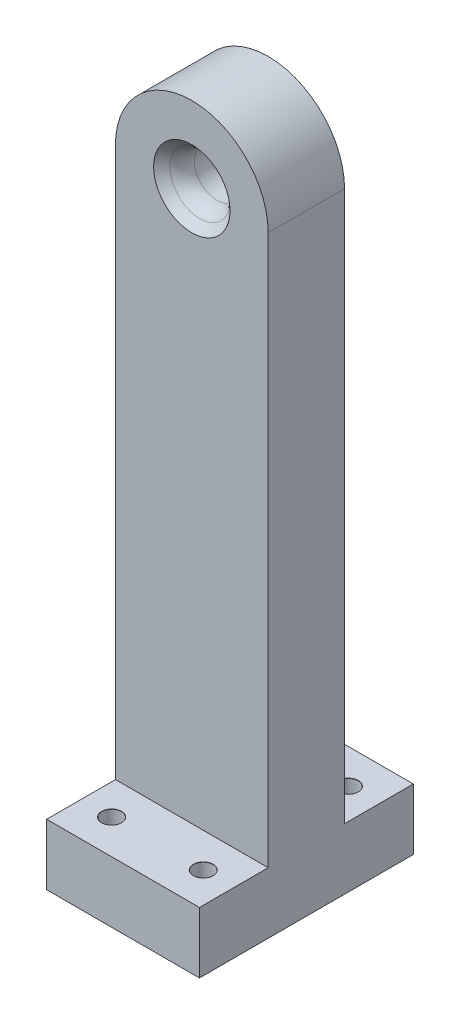
ISO-10303-21;
HEADER;
FILE_DESCRIPTION(('STEP AP214'),'2;1');
FILE_NAME('part.step','',(''),(''),'','','');
FILE_SCHEMA(('AUTOMOTIVE_DESIGN { 1 0 10303 214 1 1 1 1 }'));
ENDSEC;
DATA;
#1=APPLICATION_CONTEXT('core data for automotive mechanical design processes');
#2=APPLICATION_PROTOCOL_DEFINITION('international standard','automotive_design',2000,#1);
#3=PRODUCT_CONTEXT('',#1,'mechanical');
#4=PRODUCT('Part','Part','',(#3));
#5=PRODUCT_RELATED_PRODUCT_CATEGORY('part','',(#4));
#6=PRODUCT_DEFINITION_FORMATION('','',#4);
#7=PRODUCT_DEFINITION_CONTEXT('part definition',#1,'design');
#8=PRODUCT_DEFINITION('design','',#6,#7);
#9=PRODUCT_DEFINITION_SHAPE('','',#8);
#10=(LENGTH_UNIT() NAMED_UNIT(*) SI_UNIT(.MILLI.,.METRE.));
#11=(NAMED_UNIT(*) PLANE_ANGLE_UNIT() SI_UNIT($,.RADIAN.));
#12=(NAMED_UNIT(*) SI_UNIT($,.STERADIAN.) SOLID_ANGLE_UNIT());
#13=UNCERTAINTY_MEASURE_WITH_UNIT(LENGTH_MEASURE(1.E-05),#10,'distance_accuracy_value','');
#14=(GEOMETRIC_REPRESENTATION_CONTEXT(3) GLOBAL_UNCERTAINTY_ASSIGNED_CONTEXT((#13)) GLOBAL_UNIT_ASSIGNED_CONTEXT((#10,
#11,#12)) REPRESENTATION_CONTEXT('',''));
#15=CARTESIAN_POINT('',(0.,0.,0.));
#16=DIRECTION('',(0.,0.,1.));
#17=DIRECTION('',(1.,0.,0.));
#18=AXIS2_PLACEMENT_3D('',#15,#16,#17);
#19=CARTESIAN_POINT('',(0.,100.,35.));
#20=DIRECTION('',(0.,0.,-1.));
#21=DIRECTION('',(-1.,0.,0.));
#22=AXIS2_PLACEMENT_3D('',#19,#20,#21);
#23=PLANE('',#22);
#24=DIRECTION('',(0.,1.,0.));
#25=VECTOR('',#24,1.);
#26=CARTESIAN_POINT('',(12.5,100.,35.));
#27=LINE('',#26,#25);
#28=CARTESIAN_POINT('',(12.5,0.,35.));
#29=VERTEX_POINT('',#28);
#30=CARTESIAN_POINT('',(12.5,10.,35.));
#31=VERTEX_POINT('',#30);
#32=EDGE_CURVE('E122',#29,#31,#27,.T.);
#33=ORIENTED_EDGE('',*,*,#32,.T.);
#34=DIRECTION('',(1.,0.,0.));
#35=VECTOR('',#34,1.);
#36=CARTESIAN_POINT('',(-12.5,9.99999999999999,35.));
#37=LINE('',#36,#35);
#38=CARTESIAN_POINT('',(-12.5,9.99999999999999,35.));
#39=VERTEX_POINT('',#38);
#40=EDGE_CURVE('E110',#39,#31,#37,.T.);
#41=ORIENTED_EDGE('',*,*,#40,.F.);
#42=DIRECTION('',(0.,-1.,0.));
#43=VECTOR('',#42,1.);
#44=CARTESIAN_POINT('',(-12.5,0.,35.));
#45=LINE('',#44,#43);
#46=CARTESIAN_POINT('',(-12.5,0.,35.));
#47=VERTEX_POINT('',#46);
#48=EDGE_CURVE('E120',#39,#47,#45,.T.);
#49=ORIENTED_EDGE('',*,*,#48,.T.);
#50=DIRECTION('',(1.,0.,0.));
#51=VECTOR('',#50,1.);
#52=CARTESIAN_POINT('',(12.5,0.,35.));
#53=LINE('',#52,#51);
#54=EDGE_CURVE('E131',#47,#29,#53,.T.);
#55=ORIENTED_EDGE('',*,*,#54,.T.);
#56=EDGE_LOOP('',(#33,#41,#49,#55));
#57=FACE_BOUND('',#56,.T.);
#58=ADVANCED_FACE('F41',(#57),#23,.F.);
#59=CARTESIAN_POINT('',(0.,100.,0.));
#60=DIRECTION('',(0.,0.,-1.));
#61=DIRECTION('',(-1.,0.,0.));
#62=AXIS2_PLACEMENT_3D('',#59,#60,#61);
#63=PLANE('',#62);
#64=DIRECTION('',(1.,0.,0.));
#65=VECTOR('',#64,1.);
#66=CARTESIAN_POINT('',(-12.5,9.99999999999999,0.));
#67=LINE('',#66,#65);
#68=CARTESIAN_POINT('',(-12.5,9.99999999999999,0.));
#69=VERTEX_POINT('',#68);
#70=CARTESIAN_POINT('',(12.5,10.,0.));
#71=VERTEX_POINT('',#70);
#72=EDGE_CURVE('E220',#69,#71,#67,.T.);
#73=ORIENTED_EDGE('',*,*,#72,.T.);
#74=DIRECTION('',(0.,1.,0.));
#75=VECTOR('',#74,1.);
#76=CARTESIAN_POINT('',(12.5,100.,0.));
#77=LINE('',#76,#75);
#78=CARTESIAN_POINT('',(12.5,0.,0.));
#79=VERTEX_POINT('',#78);
#80=EDGE_CURVE('E135',#79,#71,#77,.T.);
#81=ORIENTED_EDGE('',*,*,#80,.F.);
#82=DIRECTION('',(1.,0.,0.));
#83=VECTOR('',#82,1.);
#84=CARTESIAN_POINT('',(0.,0.,0.));
#85=LINE('',#84,#83);
#86=CARTESIAN_POINT('',(-12.5,0.,0.));
#87=VERTEX_POINT('',#86);
#88=EDGE_CURVE('E141',#87,#79,#85,.T.);
#89=ORIENTED_EDGE('',*,*,#88,.F.);
#90=DIRECTION('',(0.,-1.,0.));
#91=VECTOR('',#90,1.);
#92=CARTESIAN_POINT('',(-12.5,0.,0.));
#93=LINE('',#92,#91);
#94=EDGE_CURVE('E138',#69,#87,#93,.T.);
#95=ORIENTED_EDGE('',*,*,#94,.F.);
#96=EDGE_LOOP('',(#73,#81,#89,#95));
#97=FACE_BOUND('',#96,.T.);
#98=ADVANCED_FACE('F173',(#97),#63,.T.);
#99=CARTESIAN_POINT('',(12.5,100.,35.));
#100=DIRECTION('',(-1.,0.,0.));
#101=DIRECTION('',(0.,-1.,0.));
#102=AXIS2_PLACEMENT_3D('',#99,#100,#101);
#103=PLANE('',#102);
#104=DIRECTION('',(0.,0.,-1.));
#105=VECTOR('',#104,1.);
#106=CARTESIAN_POINT('',(12.5,100.,35.));
#107=LINE('',#106,#105);
#108=CARTESIAN_POINT('',(12.5,100.,23.75));
#109=VERTEX_POINT('',#108);
#110=CARTESIAN_POINT('',(12.5,100.,11.25));
#111=VERTEX_POINT('',#110);
#112=EDGE_CURVE('E145',#109,#111,#107,.T.);
#113=ORIENTED_EDGE('',*,*,#112,.F.);
#114=DIRECTION('',(0.,1.,0.));
#115=VECTOR('',#114,1.);
#116=CARTESIAN_POINT('',(12.5,10.,23.75));
#117=LINE('',#116,#115);
#118=CARTESIAN_POINT('',(12.5,10.,23.75));
#119=VERTEX_POINT('',#118);
#120=EDGE_CURVE('E115',#119,#109,#117,.T.);
#121=ORIENTED_EDGE('',*,*,#120,.F.);
#122=DIRECTION('',(0.,0.,-1.));
#123=VECTOR('',#122,1.);
#124=CARTESIAN_POINT('',(12.5,10.,35.));
#125=LINE('',#124,#123);
#126=EDGE_CURVE('E212',#31,#119,#125,.T.);
#127=ORIENTED_EDGE('',*,*,#126,.F.);
#128=ORIENTED_EDGE('',*,*,#32,.F.);
#129=DIRECTION('',(0.,0.,-1.));
#130=VECTOR('',#129,1.);
#131=CARTESIAN_POINT('',(12.5,0.,35.));
#132=LINE('',#131,#130);
#133=EDGE_CURVE('E148',#29,#79,#132,.T.);
#134=ORIENTED_EDGE('',*,*,#133,.T.);
#135=ORIENTED_EDGE('',*,*,#80,.T.);
#136=DIRECTION('',(0.,0.,-1.));
#137=VECTOR('',#136,1.);
#138=CARTESIAN_POINT('',(12.5,10.,0.));
#139=LINE('',#138,#137);
#140=CARTESIAN_POINT('',(12.5,10.,11.25));
#141=VERTEX_POINT('',#140);
#142=EDGE_CURVE('E224',#141,#71,#139,.T.);
#143=ORIENTED_EDGE('',*,*,#142,.F.);
#144=DIRECTION('',(0.,-1.,0.));
#145=VECTOR('',#144,1.);
#146=CARTESIAN_POINT('',(12.5,10.,11.25));
#147=LINE('',#146,#145);
#148=EDGE_CURVE('E207',#111,#141,#147,.T.);
#149=ORIENTED_EDGE('',*,*,#148,.F.);
#150=EDGE_LOOP('',(#113,#121,#127,#128,#134,#135,#143,#149));
#151=FACE_BOUND('',#150,.T.);
#152=ADVANCED_FACE('F178',(#151),#103,.F.);
#153=CARTESIAN_POINT('',(0.,100.,35.));
#154=DIRECTION('',(0.,0.,-1.));
#155=DIRECTION('',(-1.,0.,0.));
#156=AXIS2_PLACEMENT_3D('',#153,#154,#155);
#157=CYLINDRICAL_SURFACE('',#156,12.5);
#158=DIRECTION('',(0.,0.,-1.));
#159=VECTOR('',#158,1.);
#160=CARTESIAN_POINT('',(-12.5,100.,35.));
#161=LINE('',#160,#159);
#162=CARTESIAN_POINT('',(-12.5,100.,23.75));
#163=VERTEX_POINT('',#162);
#164=CARTESIAN_POINT('',(-12.5,100.,11.25));
#165=VERTEX_POINT('',#164);
#166=EDGE_CURVE('E129',#163,#165,#161,.T.);
#167=ORIENTED_EDGE('',*,*,#166,.F.);
#168=CARTESIAN_POINT('',(0.,100.,23.75));
#169=DIRECTION('',(0.,0.,-1.));
#170=DIRECTION('',(-1.,0.,0.));
#171=AXIS2_PLACEMENT_3D('',#168,#169,#170);
#172=CIRCLE('',#171,12.5);
#173=EDGE_CURVE('E139',#163,#109,#172,.T.);
#174=ORIENTED_EDGE('',*,*,#173,.T.);
#175=ORIENTED_EDGE('',*,*,#112,.T.);
#176=CARTESIAN_POINT('',(0.,100.,11.25));
#177=DIRECTION('',(0.,0.,1.));
#178=DIRECTION('',(1.,0.,0.));
#179=AXIS2_PLACEMENT_3D('',#176,#177,#178);
#180=CIRCLE('',#179,12.5);
#181=EDGE_CURVE('E155',#111,#165,#180,.T.);
#182=ORIENTED_EDGE('',*,*,#181,.T.);
#183=EDGE_LOOP('',(#167,#174,#175,#182));
#184=FACE_BOUND('',#183,.T.);
#185=ADVANCED_FACE('F191',(#184),#157,.T.);
#186=CARTESIAN_POINT('',(-12.5,0.,35.));
#187=DIRECTION('',(1.,0.,0.));
#188=DIRECTION('',(0.,0.,-1.));
#189=AXIS2_PLACEMENT_3D('',#186,#187,#188);
#190=PLANE('',#189);
#191=DIRECTION('',(0.,0.,-1.));
#192=VECTOR('',#191,1.);
#193=CARTESIAN_POINT('',(-12.5,9.99999999999999,35.));
#194=LINE('',#193,#192);
#195=CARTESIAN_POINT('',(-12.5,9.99999999999999,23.75));
#196=VERTEX_POINT('',#195);
#197=EDGE_CURVE('E106',#39,#196,#194,.T.);
#198=ORIENTED_EDGE('',*,*,#197,.T.);
#199=DIRECTION('',(0.,1.,0.));
#200=VECTOR('',#199,1.);
#201=CARTESIAN_POINT('',(-12.5,9.99999999999999,23.75));
#202=LINE('',#201,#200);
#203=EDGE_CURVE('E56',#196,#163,#202,.T.);
#204=ORIENTED_EDGE('',*,*,#203,.T.);
#205=ORIENTED_EDGE('',*,*,#166,.T.);
#206=DIRECTION('',(0.,-1.,0.));
#207=VECTOR('',#206,1.);
#208=CARTESIAN_POINT('',(-12.5,9.99999999999999,11.25));
#209=LINE('',#208,#207);
#210=CARTESIAN_POINT('',(-12.5,9.99999999999999,11.25));
#211=VERTEX_POINT('',#210);
#212=EDGE_CURVE('E226',#165,#211,#209,.T.);
#213=ORIENTED_EDGE('',*,*,#212,.T.);
#214=DIRECTION('',(0.,0.,-1.));
#215=VECTOR('',#214,1.);
#216=CARTESIAN_POINT('',(-12.5,9.99999999999999,0.));
#217=LINE('',#216,#215);
#218=EDGE_CURVE('E64',#211,#69,#217,.T.);
#219=ORIENTED_EDGE('',*,*,#218,.T.);
#220=ORIENTED_EDGE('',*,*,#94,.T.);
#221=DIRECTION('',(0.,0.,-1.));
#222=VECTOR('',#221,1.);
#223=CARTESIAN_POINT('',(-12.5,0.,35.));
#224=LINE('',#223,#222);
#225=EDGE_CURVE('E127',#47,#87,#224,.T.);
#226=ORIENTED_EDGE('',*,*,#225,.F.);
#227=ORIENTED_EDGE('',*,*,#48,.F.);
#228=EDGE_LOOP('',(#198,#204,#205,#213,#219,#220,#226,#227));
#229=FACE_BOUND('',#228,.T.);
#230=ADVANCED_FACE('F125',(#229),#190,.F.);
#231=CARTESIAN_POINT('',(0.,0.,35.));
#232=DIRECTION('',(0.,1.,0.));
#233=DIRECTION('',(-1.,0.,0.));
#234=AXIS2_PLACEMENT_3D('',#231,#232,#233);
#235=PLANE('',#234);
#236=CARTESIAN_POINT('',(-7.5,0.,5.625));
#237=DIRECTION('',(0.,1.,0.));
#238=DIRECTION('',(0.,0.,1.));
#239=AXIS2_PLACEMENT_3D('',#236,#237,#238);
#240=CIRCLE('',#239,1.6);
#241=CARTESIAN_POINT('',(-7.5,0.,7.225));
#242=VERTEX_POINT('',#241);
#243=EDGE_CURVE('E292',#242,#242,#240,.T.);
#244=ORIENTED_EDGE('',*,*,#243,.T.);
#245=EDGE_LOOP('',(#244));
#246=FACE_BOUND('',#245,.T.);
#247=CARTESIAN_POINT('',(7.5,0.,5.625));
#248=DIRECTION('',(0.,1.,0.));
#249=DIRECTION('',(0.,0.,1.));
#250=AXIS2_PLACEMENT_3D('',#247,#248,#249);
#251=CIRCLE('',#250,1.6);
#252=CARTESIAN_POINT('',(7.5,0.,7.225));
#253=VERTEX_POINT('',#252);
#254=EDGE_CURVE('E303',#253,#253,#251,.T.);
#255=ORIENTED_EDGE('',*,*,#254,.T.);
#256=EDGE_LOOP('',(#255));
#257=FACE_BOUND('',#256,.T.);
#258=CARTESIAN_POINT('',(7.5,0.,29.375));
#259=DIRECTION('',(0.,1.,0.));
#260=DIRECTION('',(0.,0.,1.));
#261=AXIS2_PLACEMENT_3D('',#258,#259,#260);
#262=CIRCLE('',#261,1.6);
#263=CARTESIAN_POINT('',(7.5,0.,30.975));
#264=VERTEX_POINT('',#263);
#265=EDGE_CURVE('E312',#264,#264,#262,.T.);
#266=ORIENTED_EDGE('',*,*,#265,.T.);
#267=EDGE_LOOP('',(#266));
#268=FACE_BOUND('',#267,.T.);
#269=CARTESIAN_POINT('',(-7.5,0.,29.375));
#270=DIRECTION('',(0.,1.,0.));
#271=DIRECTION('',(0.,0.,1.));
#272=AXIS2_PLACEMENT_3D('',#269,#270,#271);
#273=CIRCLE('',#272,1.6);
#274=CARTESIAN_POINT('',(-7.5,0.,30.975));
#275=VERTEX_POINT('',#274);
#276=EDGE_CURVE('E223',#275,#275,#273,.T.);
#277=ORIENTED_EDGE('',*,*,#276,.T.);
#278=EDGE_LOOP('',(#277));
#279=FACE_BOUND('',#278,.T.);
#280=ORIENTED_EDGE('',*,*,#88,.T.);
#281=ORIENTED_EDGE('',*,*,#133,.F.);
#282=ORIENTED_EDGE('',*,*,#54,.F.);
#283=ORIENTED_EDGE('',*,*,#225,.T.);
#284=EDGE_LOOP('',(#280,#281,#282,#283));
#285=FACE_BOUND('',#284,.T.);
#286=ADVANCED_FACE('F184',(#246,#257,#268,#279,#285),#235,.F.);
#287=CARTESIAN_POINT('',(-12.5,9.99999999999999,11.25));
#288=DIRECTION('',(0.,0.,1.));
#289=DIRECTION('',(1.,0.,0.));
#290=AXIS2_PLACEMENT_3D('',#287,#288,#289);
#291=PLANE('',#290);
#292=CARTESIAN_POINT('',(0.,100.,11.25));
#293=DIRECTION('',(0.,0.,1.));
#294=DIRECTION('',(1.,0.,0.));
#295=AXIS2_PLACEMENT_3D('',#292,#293,#294);
#296=CIRCLE('',#295,3.75);
#297=CARTESIAN_POINT('',(3.75,100.,11.25));
#298=VERTEX_POINT('',#297);
#299=EDGE_CURVE('E152',#298,#298,#296,.T.);
#300=ORIENTED_EDGE('',*,*,#299,.T.);
#301=EDGE_LOOP('',(#300));
#302=FACE_BOUND('',#301,.T.);
#303=ORIENTED_EDGE('',*,*,#148,.T.);
#304=DIRECTION('',(1.,0.,0.));
#305=VECTOR('',#304,1.);
#306=CARTESIAN_POINT('',(-12.5,9.99999999999999,11.25));
#307=LINE('',#306,#305);
#308=EDGE_CURVE('E218',#211,#141,#307,.T.);
#309=ORIENTED_EDGE('',*,*,#308,.F.);
#310=ORIENTED_EDGE('',*,*,#212,.F.);
#311=ORIENTED_EDGE('',*,*,#181,.F.);
#312=EDGE_LOOP('',(#303,#309,#310,#311));
#313=FACE_BOUND('',#312,.T.);
#314=ADVANCED_FACE('F187',(#302,#313),#291,.F.);
#315=CARTESIAN_POINT('',(-12.5,9.99999999999999,0.));
#316=DIRECTION('',(0.,-1.,0.));
#317=DIRECTION('',(1.,0.,0.));
#318=AXIS2_PLACEMENT_3D('',#315,#316,#317);
#319=PLANE('',#318);
#320=CARTESIAN_POINT('',(-7.5,10.,5.625));
#321=DIRECTION('',(0.,1.,0.));
#322=DIRECTION('',(0.,0.,1.));
#323=AXIS2_PLACEMENT_3D('',#320,#321,#322);
#324=CIRCLE('',#323,1.625);
#325=CARTESIAN_POINT('',(-7.5,10.,7.25));
#326=VERTEX_POINT('',#325);
#327=EDGE_CURVE('E290',#326,#326,#324,.T.);
#328=ORIENTED_EDGE('',*,*,#327,.F.);
#329=EDGE_LOOP('',(#328));
#330=FACE_BOUND('',#329,.T.);
#331=CARTESIAN_POINT('',(7.5,10.,5.625));
#332=DIRECTION('',(0.,1.,0.));
#333=DIRECTION('',(0.,0.,1.));
#334=AXIS2_PLACEMENT_3D('',#331,#332,#333);
#335=CIRCLE('',#334,1.625);
#336=CARTESIAN_POINT('',(7.5,10.,7.25));
#337=VERTEX_POINT('',#336);
#338=EDGE_CURVE('E297',#337,#337,#335,.T.);
#339=ORIENTED_EDGE('',*,*,#338,.F.);
#340=EDGE_LOOP('',(#339));
#341=FACE_BOUND('',#340,.T.);
#342=ORIENTED_EDGE('',*,*,#142,.T.);
#343=ORIENTED_EDGE('',*,*,#72,.F.);
#344=ORIENTED_EDGE('',*,*,#218,.F.);
#345=ORIENTED_EDGE('',*,*,#308,.T.);
#346=EDGE_LOOP('',(#342,#343,#344,#345));
#347=FACE_BOUND('',#346,.T.);
#348=ADVANCED_FACE('F236',(#330,#341,#347),#319,.F.);
#349=CARTESIAN_POINT('',(-12.5,9.99999999999999,23.75));
#350=DIRECTION('',(0.,0.,-1.));
#351=DIRECTION('',(-1.,0.,0.));
#352=AXIS2_PLACEMENT_3D('',#349,#350,#351);
#353=PLANE('',#352);
#354=CARTESIAN_POINT('',(0.,100.,23.75));
#355=DIRECTION('',(0.,0.,-1.));
#356=DIRECTION('',(-1.,0.,0.));
#357=AXIS2_PLACEMENT_3D('',#354,#355,#356);
#358=CIRCLE('',#357,6.25000000000001);
#359=CARTESIAN_POINT('',(-6.25000000000001,100.,23.75));
#360=VERTEX_POINT('',#359);
#361=EDGE_CURVE('E151',#360,#360,#358,.T.);
#362=ORIENTED_EDGE('',*,*,#361,.T.);
#363=EDGE_LOOP('',(#362));
#364=FACE_BOUND('',#363,.T.);
#365=ORIENTED_EDGE('',*,*,#203,.F.);
#366=DIRECTION('',(1.,0.,0.));
#367=VECTOR('',#366,1.);
#368=CARTESIAN_POINT('',(-12.5,9.99999999999999,23.75));
#369=LINE('',#368,#367);
#370=EDGE_CURVE('E112',#196,#119,#369,.T.);
#371=ORIENTED_EDGE('',*,*,#370,.T.);
#372=ORIENTED_EDGE('',*,*,#120,.T.);
#373=ORIENTED_EDGE('',*,*,#173,.F.);
#374=EDGE_LOOP('',(#365,#371,#372,#373));
#375=FACE_BOUND('',#374,.T.);
#376=ADVANCED_FACE('F211',(#364,#375),#353,.F.);
#377=CARTESIAN_POINT('',(-12.5,9.99999999999999,35.));
#378=DIRECTION('',(0.,-1.,0.));
#379=DIRECTION('',(1.,0.,0.));
#380=AXIS2_PLACEMENT_3D('',#377,#378,#379);
#381=PLANE('',#380);
#382=CARTESIAN_POINT('',(7.5,10.,29.375));
#383=DIRECTION('',(0.,1.,0.));
#384=DIRECTION('',(0.,0.,1.));
#385=AXIS2_PLACEMENT_3D('',#382,#383,#384);
#386=CIRCLE('',#385,1.625);
#387=CARTESIAN_POINT('',(7.5,10.,31.));
#388=VERTEX_POINT('',#387);
#389=EDGE_CURVE('E306',#388,#388,#386,.T.);
#390=ORIENTED_EDGE('',*,*,#389,.F.);
#391=EDGE_LOOP('',(#390));
#392=FACE_BOUND('',#391,.T.);
#393=CARTESIAN_POINT('',(-7.5,10.,29.375));
#394=DIRECTION('',(0.,1.,0.));
#395=DIRECTION('',(0.,0.,1.));
#396=AXIS2_PLACEMENT_3D('',#393,#394,#395);
#397=CIRCLE('',#396,1.625);
#398=CARTESIAN_POINT('',(-7.5,10.,31.));
#399=VERTEX_POINT('',#398);
#400=EDGE_CURVE('E315',#399,#399,#397,.T.);
#401=ORIENTED_EDGE('',*,*,#400,.F.);
#402=EDGE_LOOP('',(#401));
#403=FACE_BOUND('',#402,.T.);
#404=ORIENTED_EDGE('',*,*,#126,.T.);
#405=ORIENTED_EDGE('',*,*,#370,.F.);
#406=ORIENTED_EDGE('',*,*,#197,.F.);
#407=ORIENTED_EDGE('',*,*,#40,.T.);
#408=EDGE_LOOP('',(#404,#405,#406,#407));
#409=FACE_BOUND('',#408,.T.);
#410=ADVANCED_FACE('F109',(#392,#403,#409),#381,.F.);
#411=CARTESIAN_POINT('',(0.,100.,35.));
#412=DIRECTION('',(0.,0.,-1.));
#413=DIRECTION('',(-1.,0.,0.));
#414=AXIS2_PLACEMENT_3D('',#411,#412,#413);
#415=CYLINDRICAL_SURFACE('',#414,3.75);
#416=CARTESIAN_POINT('',(0.,100.,19.5931457505076));
#417=DIRECTION('',(0.,0.,-1.));
#418=DIRECTION('',(-1.,0.,0.));
#419=AXIS2_PLACEMENT_3D('',#416,#417,#418);
#420=CIRCLE('',#419,3.75);
#421=CARTESIAN_POINT('',(-3.75,100.,19.5931457505076));
#422=VERTEX_POINT('',#421);
#423=EDGE_CURVE('E49',#422,#422,#420,.F.);
#424=ORIENTED_EDGE('',*,*,#423,.T.);
#425=EDGE_LOOP('',(#424));
#426=FACE_BOUND('',#425,.T.);
#427=ORIENTED_EDGE('',*,*,#299,.F.);
#428=EDGE_LOOP('',(#427));
#429=FACE_BOUND('',#428,.T.);
#430=ADVANCED_FACE('F160',(#426,#429),#415,.F.);
#431=CARTESIAN_POINT('',(-7.5,9.99999999999999,29.375));
#432=DIRECTION('',(0.,1.,0.));
#433=DIRECTION('',(0.,0.,1.));
#434=AXIS2_PLACEMENT_3D('',#431,#432,#433);
#435=CYLINDRICAL_SURFACE('',#434,1.6);
#436=ORIENTED_EDGE('',*,*,#276,.F.);
#437=EDGE_LOOP('',(#436));
#438=FACE_BOUND('',#437,.T.);
#439=CARTESIAN_POINT('',(-7.5,9.97499999999999,29.375));
#440=DIRECTION('',(0.,1.,0.));
#441=DIRECTION('',(0.,0.,1.));
#442=AXIS2_PLACEMENT_3D('',#439,#440,#441);
#443=CIRCLE('',#442,1.6);
#444=CARTESIAN_POINT('',(-7.5,9.97499999999999,30.975));
#445=VERTEX_POINT('',#444);
#446=EDGE_CURVE('E318',#445,#445,#443,.T.);
#447=ORIENTED_EDGE('',*,*,#446,.T.);
#448=EDGE_LOOP('',(#447));
#449=FACE_BOUND('',#448,.T.);
#450=ADVANCED_FACE('F252',(#438,#449),#435,.F.);
#451=CARTESIAN_POINT('',(-7.5,10.,29.375));
#452=DIRECTION('',(0.,1.,0.));
#453=DIRECTION('',(0.,0.,1.));
#454=AXIS2_PLACEMENT_3D('',#451,#452,#453);
#455=CONICAL_SURFACE('',#454,1.625,0.785398163397396);
#456=ORIENTED_EDGE('',*,*,#446,.F.);
#457=EDGE_LOOP('',(#456));
#458=FACE_BOUND('',#457,.T.);
#459=ORIENTED_EDGE('',*,*,#400,.T.);
#460=EDGE_LOOP('',(#459));
#461=FACE_BOUND('',#460,.T.);
#462=ADVANCED_FACE('F255',(#458,#461),#455,.F.);
#463=CARTESIAN_POINT('',(7.5,10.,29.375));
#464=DIRECTION('',(0.,1.,0.));
#465=DIRECTION('',(0.,0.,1.));
#466=AXIS2_PLACEMENT_3D('',#463,#464,#465);
#467=CYLINDRICAL_SURFACE('',#466,1.6);
#468=ORIENTED_EDGE('',*,*,#265,.F.);
#469=EDGE_LOOP('',(#468));
#470=FACE_BOUND('',#469,.T.);
#471=CARTESIAN_POINT('',(7.5,9.975,29.375));
#472=DIRECTION('',(0.,1.,0.));
#473=DIRECTION('',(0.,0.,1.));
#474=AXIS2_PLACEMENT_3D('',#471,#472,#473);
#475=CIRCLE('',#474,1.6);
#476=CARTESIAN_POINT('',(7.5,9.975,30.975));
#477=VERTEX_POINT('',#476);
#478=EDGE_CURVE('E309',#477,#477,#475,.T.);
#479=ORIENTED_EDGE('',*,*,#478,.T.);
#480=EDGE_LOOP('',(#479));
#481=FACE_BOUND('',#480,.T.);
#482=ADVANCED_FACE('F259',(#470,#481),#467,.F.);
#483=CARTESIAN_POINT('',(7.5,10.,29.375));
#484=DIRECTION('',(0.,1.,0.));
#485=DIRECTION('',(0.,0.,1.));
#486=AXIS2_PLACEMENT_3D('',#483,#484,#485);
#487=CONICAL_SURFACE('',#486,1.625,0.785398163397414);
#488=ORIENTED_EDGE('',*,*,#478,.F.);
#489=EDGE_LOOP('',(#488));
#490=FACE_BOUND('',#489,.T.);
#491=ORIENTED_EDGE('',*,*,#389,.T.);
#492=EDGE_LOOP('',(#491));
#493=FACE_BOUND('',#492,.T.);
#494=ADVANCED_FACE('F263',(#490,#493),#487,.F.);
#495=CARTESIAN_POINT('',(7.5,10.,5.625));
#496=DIRECTION('',(0.,1.,0.));
#497=DIRECTION('',(0.,0.,1.));
#498=AXIS2_PLACEMENT_3D('',#495,#496,#497);
#499=CYLINDRICAL_SURFACE('',#498,1.6);
#500=ORIENTED_EDGE('',*,*,#254,.F.);
#501=EDGE_LOOP('',(#500));
#502=FACE_BOUND('',#501,.T.);
#503=CARTESIAN_POINT('',(7.5,9.975,5.625));
#504=DIRECTION('',(0.,1.,0.));
#505=DIRECTION('',(0.,0.,1.));
#506=AXIS2_PLACEMENT_3D('',#503,#504,#505);
#507=CIRCLE('',#506,1.6);
#508=CARTESIAN_POINT('',(7.5,9.975,7.225));
#509=VERTEX_POINT('',#508);
#510=EDGE_CURVE('E300',#509,#509,#507,.T.);
#511=ORIENTED_EDGE('',*,*,#510,.T.);
#512=EDGE_LOOP('',(#511));
#513=FACE_BOUND('',#512,.T.);
#514=ADVANCED_FACE('F267',(#502,#513),#499,.F.);
#515=CARTESIAN_POINT('',(7.5,10.,5.625));
#516=DIRECTION('',(0.,1.,0.));
#517=DIRECTION('',(0.,0.,1.));
#518=AXIS2_PLACEMENT_3D('',#515,#516,#517);
#519=CONICAL_SURFACE('',#518,1.625,0.785398163397379);
#520=ORIENTED_EDGE('',*,*,#510,.F.);
#521=EDGE_LOOP('',(#520));
#522=FACE_BOUND('',#521,.T.);
#523=ORIENTED_EDGE('',*,*,#338,.T.);
#524=EDGE_LOOP('',(#523));
#525=FACE_BOUND('',#524,.T.);
#526=ADVANCED_FACE('F271',(#522,#525),#519,.F.);
#527=CARTESIAN_POINT('',(-7.5,9.99999999999999,5.625));
#528=DIRECTION('',(0.,1.,0.));
#529=DIRECTION('',(0.,0.,1.));
#530=AXIS2_PLACEMENT_3D('',#527,#528,#529);
#531=CYLINDRICAL_SURFACE('',#530,1.6);
#532=ORIENTED_EDGE('',*,*,#243,.F.);
#533=EDGE_LOOP('',(#532));
#534=FACE_BOUND('',#533,.T.);
#535=CARTESIAN_POINT('',(-7.5,9.97499999999999,5.625));
#536=DIRECTION('',(0.,1.,0.));
#537=DIRECTION('',(0.,0.,1.));
#538=AXIS2_PLACEMENT_3D('',#535,#536,#537);
#539=CIRCLE('',#538,1.6);
#540=CARTESIAN_POINT('',(-7.5,9.97499999999999,7.225));
#541=VERTEX_POINT('',#540);
#542=EDGE_CURVE('E287',#541,#541,#539,.T.);
#543=ORIENTED_EDGE('',*,*,#542,.T.);
#544=EDGE_LOOP('',(#543));
#545=FACE_BOUND('',#544,.T.);
#546=ADVANCED_FACE('F275',(#534,#545),#531,.F.);
#547=CARTESIAN_POINT('',(-7.5,10.,5.625));
#548=DIRECTION('',(0.,1.,0.));
#549=DIRECTION('',(0.,0.,1.));
#550=AXIS2_PLACEMENT_3D('',#547,#548,#549);
#551=CONICAL_SURFACE('',#550,1.625,0.785398163397396);
#552=ORIENTED_EDGE('',*,*,#542,.F.);
#553=EDGE_LOOP('',(#552));
#554=FACE_BOUND('',#553,.T.);
#555=ORIENTED_EDGE('',*,*,#327,.T.);
#556=EDGE_LOOP('',(#555));
#557=FACE_BOUND('',#556,.T.);
#558=ADVANCED_FACE('F169',(#554,#557),#551,.F.);
#559=CARTESIAN_POINT('',(0.,100.,23.75));
#560=DIRECTION('',(0.,0.,1.));
#561=DIRECTION('',(1.,0.,0.));
#562=AXIS2_PLACEMENT_3D('',#559,#560,#561);
#563=CONICAL_SURFACE('',#562,6.25000000000001,0.785398163397445);
#564=CARTESIAN_POINT('',(0.,100.,22.4215728752538));
#565=DIRECTION('',(0.,0.,-1.));
#566=DIRECTION('',(-1.,0.,0.));
#567=AXIS2_PLACEMENT_3D('',#564,#565,#566);
#568=CIRCLE('',#567,4.9215728752538);
#569=CARTESIAN_POINT('',(-4.9215728752538,100.,22.4215728752538));
#570=VERTEX_POINT('',#569);
#571=EDGE_CURVE('E11',#570,#570,#568,.T.);
#572=ORIENTED_EDGE('',*,*,#571,.T.);
#573=EDGE_LOOP('',(#572));
#574=FACE_BOUND('',#573,.T.);
#575=ORIENTED_EDGE('',*,*,#361,.F.);
#576=EDGE_LOOP('',(#575));
#577=FACE_BOUND('',#576,.T.);
#578=ADVANCED_FACE('F164',(#574,#577),#563,.F.);
#579=CARTESIAN_POINT('',(0.,100.,19.5931457505076));
#580=DIRECTION('',(0.,0.,-1.));
#581=DIRECTION('',(-1.,0.,0.));
#582=AXIS2_PLACEMENT_3D('',#579,#580,#581);
#583=TOROIDAL_SURFACE('',#582,7.75,4.);
#584=ORIENTED_EDGE('',*,*,#571,.F.);
#585=EDGE_LOOP('',(#584));
#586=FACE_BOUND('',#585,.T.);
#587=ORIENTED_EDGE('',*,*,#423,.F.);
#588=EDGE_LOOP('',(#587));
#589=FACE_BOUND('',#588,.T.);
#590=ADVANCED_FACE('F43',(#586,#589),#583,.T.);
#591=CLOSED_SHELL('',(#58,#98,#152,#185,#230,#286,#314,#348,#376,#410,#430,#450,#462,#482,#494,
#514,#526,#546,#558,#578,#590));
#592=MANIFOLD_SOLID_BREP('B2',#591);
#593=ADVANCED_BREP_SHAPE_REPRESENTATION('',(#18,#592),#14);
#594=SHAPE_DEFINITION_REPRESENTATION(#9,#593);
ENDSEC;
END-ISO-10303-21;
